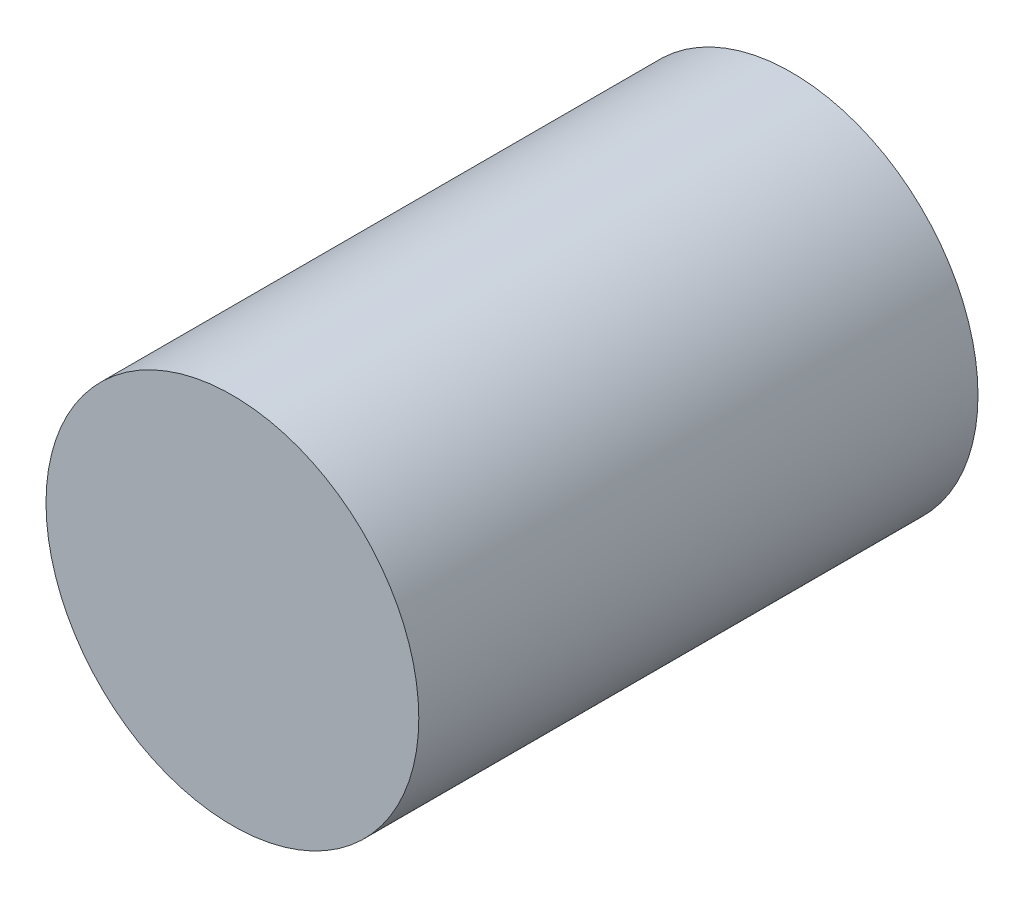
ISO-10303-21;
HEADER;
FILE_DESCRIPTION(('STEP AP214'),'2;1');
FILE_NAME('part.step','',(''),(''),'','','');
FILE_SCHEMA(('AUTOMOTIVE_DESIGN { 1 0 10303 214 1 1 1 1 }'));
ENDSEC;
DATA;
#1=APPLICATION_CONTEXT('core data for automotive mechanical design processes');
#2=APPLICATION_PROTOCOL_DEFINITION('international standard','automotive_design',2000,#1);
#3=PRODUCT_CONTEXT('',#1,'mechanical');
#4=PRODUCT('Part','Part','',(#3));
#5=PRODUCT_RELATED_PRODUCT_CATEGORY('part','',(#4));
#6=PRODUCT_DEFINITION_FORMATION('','',#4);
#7=PRODUCT_DEFINITION_CONTEXT('part definition',#1,'design');
#8=PRODUCT_DEFINITION('design','',#6,#7);
#9=PRODUCT_DEFINITION_SHAPE('','',#8);
#10=(LENGTH_UNIT() NAMED_UNIT(*) SI_UNIT(.MILLI.,.METRE.));
#11=(NAMED_UNIT(*) PLANE_ANGLE_UNIT() SI_UNIT($,.RADIAN.));
#12=(NAMED_UNIT(*) SI_UNIT($,.STERADIAN.) SOLID_ANGLE_UNIT());
#13=UNCERTAINTY_MEASURE_WITH_UNIT(LENGTH_MEASURE(1.E-05),#10,'distance_accuracy_value','');
#14=(GEOMETRIC_REPRESENTATION_CONTEXT(3) GLOBAL_UNCERTAINTY_ASSIGNED_CONTEXT((#13)) GLOBAL_UNIT_ASSIGNED_CONTEXT((#10,
#11,#12)) REPRESENTATION_CONTEXT('',''));
#15=CARTESIAN_POINT('',(0.,0.,0.));
#16=DIRECTION('',(0.,0.,1.));
#17=DIRECTION('',(1.,0.,0.));
#18=AXIS2_PLACEMENT_3D('',#15,#16,#17);
#19=CARTESIAN_POINT('',(0.,0.,55.));
#20=DIRECTION('',(0.,0.,1.));
#21=DIRECTION('',(1.,0.,0.));
#22=AXIS2_PLACEMENT_3D('',#19,#20,#21);
#23=CYLINDRICAL_SURFACE('',#22,50.);
#24=CARTESIAN_POINT('',(0.,0.,50.));
#25=DIRECTION('',(0.,0.,1.));
#26=DIRECTION('',(1.,0.,0.));
#27=AXIS2_PLACEMENT_3D('',#24,#25,#26);
#28=CIRCLE('',#27,50.);
#29=CARTESIAN_POINT('',(50.,0.,50.));
#30=VERTEX_POINT('',#29);
#31=EDGE_CURVE('E37',#30,#30,#28,.T.);
#32=ORIENTED_EDGE('',*,*,#31,.F.);
#33=EDGE_LOOP('',(#32));
#34=FACE_BOUND('',#33,.T.);
#35=CARTESIAN_POINT('',(0.,0.,-100.));
#36=DIRECTION('',(0.,0.,1.));
#37=DIRECTION('',(1.,0.,0.));
#38=AXIS2_PLACEMENT_3D('',#35,#36,#37);
#39=CIRCLE('',#38,50.);
#40=CARTESIAN_POINT('',(50.,0.,-100.));
#41=VERTEX_POINT('',#40);
#42=EDGE_CURVE('E10',#41,#41,#39,.T.);
#43=ORIENTED_EDGE('',*,*,#42,.T.);
#44=EDGE_LOOP('',(#43));
#45=FACE_BOUND('',#44,.T.);
#46=ADVANCED_FACE('F31',(#34,#45),#23,.T.);
#47=CARTESIAN_POINT('',(-50.,0.,-100.));
#48=DIRECTION('',(0.,0.,1.));
#49=DIRECTION('',(1.,0.,0.));
#50=AXIS2_PLACEMENT_3D('',#47,#48,#49);
#51=PLANE('',#50);
#52=ORIENTED_EDGE('',*,*,#42,.F.);
#53=EDGE_LOOP('',(#52));
#54=FACE_BOUND('',#53,.T.);
#55=ADVANCED_FACE('F46',(#54),#51,.F.);
#56=CARTESIAN_POINT('',(-50.,0.,50.));
#57=DIRECTION('',(0.,0.,-1.));
#58=DIRECTION('',(-1.,0.,0.));
#59=AXIS2_PLACEMENT_3D('',#56,#57,#58);
#60=PLANE('',#59);
#61=ORIENTED_EDGE('',*,*,#31,.T.);
#62=EDGE_LOOP('',(#61));
#63=FACE_BOUND('',#62,.T.);
#64=ADVANCED_FACE('F43',(#63),#60,.F.);
#65=CLOSED_SHELL('',(#46,#55,#64));
#66=MANIFOLD_SOLID_BREP('B2',#65);
#67=ADVANCED_BREP_SHAPE_REPRESENTATION('',(#18,#66),#14);
#68=SHAPE_DEFINITION_REPRESENTATION(#9,#67);
ENDSEC;
END-ISO-10303-21;
